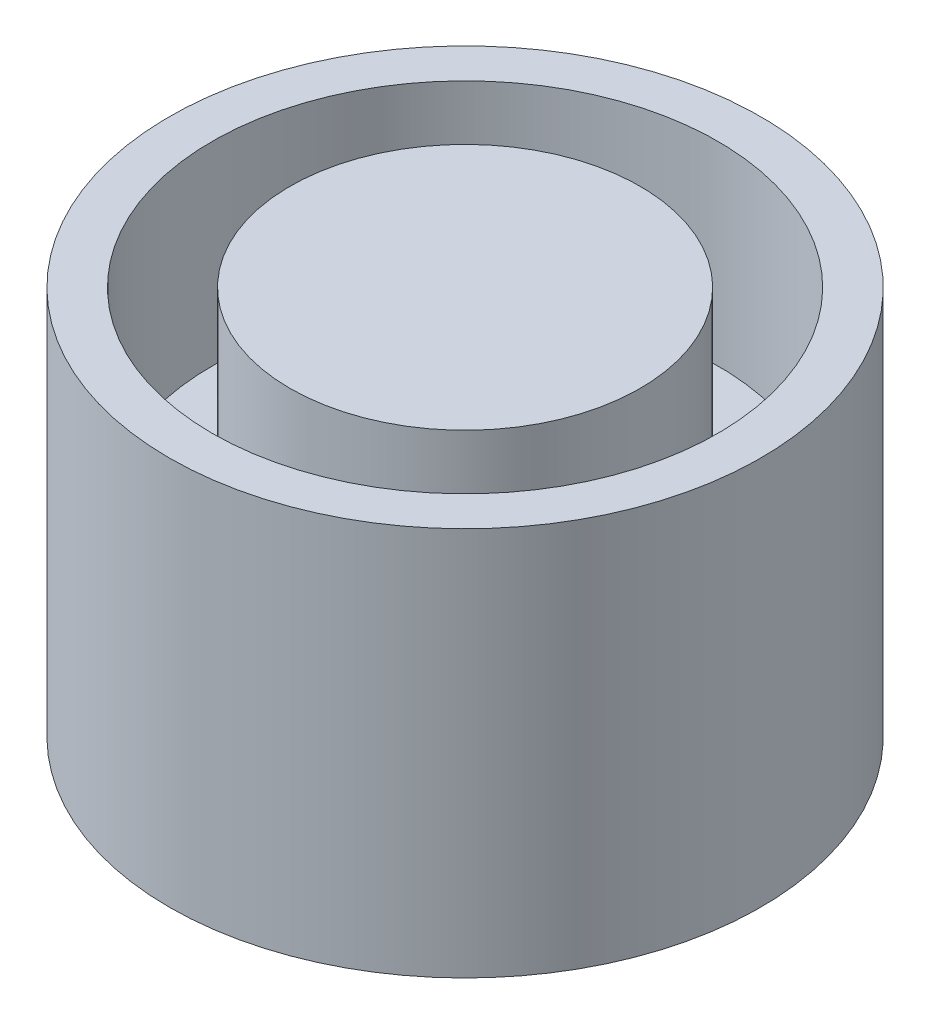
ISO-10303-21;
HEADER;
FILE_DESCRIPTION(('STEP AP214'),'2;1');
FILE_NAME('part.step','',(''),(''),'','','');
FILE_SCHEMA(('AUTOMOTIVE_DESIGN { 1 0 10303 214 1 1 1 1 }'));
ENDSEC;
DATA;
#1=APPLICATION_CONTEXT('core data for automotive mechanical design processes');
#2=APPLICATION_PROTOCOL_DEFINITION('international standard','automotive_design',2000,#1);
#3=PRODUCT_CONTEXT('',#1,'mechanical');
#4=PRODUCT('Part','Part','',(#3));
#5=PRODUCT_RELATED_PRODUCT_CATEGORY('part','',(#4));
#6=PRODUCT_DEFINITION_FORMATION('','',#4);
#7=PRODUCT_DEFINITION_CONTEXT('part definition',#1,'design');
#8=PRODUCT_DEFINITION('design','',#6,#7);
#9=PRODUCT_DEFINITION_SHAPE('','',#8);
#10=(LENGTH_UNIT() NAMED_UNIT(*) SI_UNIT(.MILLI.,.METRE.));
#11=(NAMED_UNIT(*) PLANE_ANGLE_UNIT() SI_UNIT($,.RADIAN.));
#12=(NAMED_UNIT(*) SI_UNIT($,.STERADIAN.) SOLID_ANGLE_UNIT());
#13=UNCERTAINTY_MEASURE_WITH_UNIT(LENGTH_MEASURE(1.E-05),#10,'distance_accuracy_value','');
#14=(GEOMETRIC_REPRESENTATION_CONTEXT(3) GLOBAL_UNCERTAINTY_ASSIGNED_CONTEXT((#13)) GLOBAL_UNIT_ASSIGNED_CONTEXT((#10,
#11,#12)) REPRESENTATION_CONTEXT('',''));
#15=CARTESIAN_POINT('',(0.,0.,0.));
#16=DIRECTION('',(0.,0.,1.));
#17=DIRECTION('',(1.,0.,0.));
#18=AXIS2_PLACEMENT_3D('',#15,#16,#17);
#19=CARTESIAN_POINT('',(0.,10.,0.));
#20=DIRECTION('',(0.,-1.,0.));
#21=DIRECTION('',(0.,0.,-1.));
#22=AXIS2_PLACEMENT_3D('',#19,#20,#21);
#23=CYLINDRICAL_SURFACE('',#22,7.6);
#24=CARTESIAN_POINT('',(0.,10.,0.));
#25=DIRECTION('',(0.,1.,0.));
#26=DIRECTION('',(0.,0.,1.));
#27=AXIS2_PLACEMENT_3D('',#24,#25,#26);
#28=CIRCLE('',#27,7.6);
#29=CARTESIAN_POINT('',(0.,10.,7.6));
#30=VERTEX_POINT('',#29);
#31=EDGE_CURVE('E10',#30,#30,#28,.T.);
#32=ORIENTED_EDGE('',*,*,#31,.F.);
#33=EDGE_LOOP('',(#32));
#34=FACE_BOUND('',#33,.T.);
#35=CARTESIAN_POINT('',(0.,0.,0.));
#36=DIRECTION('',(0.,1.,0.));
#37=DIRECTION('',(0.,0.,1.));
#38=AXIS2_PLACEMENT_3D('',#35,#36,#37);
#39=CIRCLE('',#38,7.6);
#40=CARTESIAN_POINT('',(0.,0.,7.6));
#41=VERTEX_POINT('',#40);
#42=EDGE_CURVE('E37',#41,#41,#39,.T.);
#43=ORIENTED_EDGE('',*,*,#42,.T.);
#44=EDGE_LOOP('',(#43));
#45=FACE_BOUND('',#44,.T.);
#46=ADVANCED_FACE('F34',(#34,#45),#23,.T.);
#47=CARTESIAN_POINT('',(0.,10.,0.));
#48=DIRECTION('',(0.,1.,0.));
#49=DIRECTION('',(0.,0.,1.));
#50=AXIS2_PLACEMENT_3D('',#47,#48,#49);
#51=PLANE('',#50);
#52=CARTESIAN_POINT('',(0.,10.,0.));
#53=DIRECTION('',(0.,1.,0.));
#54=DIRECTION('',(0.,0.,1.));
#55=AXIS2_PLACEMENT_3D('',#52,#53,#54);
#56=CIRCLE('',#55,6.5);
#57=CARTESIAN_POINT('',(0.,10.,6.5));
#58=VERTEX_POINT('',#57);
#59=EDGE_CURVE('E46',#58,#58,#56,.T.);
#60=ORIENTED_EDGE('',*,*,#59,.F.);
#61=EDGE_LOOP('',(#60));
#62=FACE_BOUND('',#61,.T.);
#63=ORIENTED_EDGE('',*,*,#31,.T.);
#64=EDGE_LOOP('',(#63));
#65=FACE_BOUND('',#64,.T.);
#66=ADVANCED_FACE('F74',(#62,#65),#51,.T.);
#67=CARTESIAN_POINT('',(0.,0.,0.));
#68=DIRECTION('',(0.,1.,0.));
#69=DIRECTION('',(0.,0.,1.));
#70=AXIS2_PLACEMENT_3D('',#67,#68,#69);
#71=PLANE('',#70);
#72=ORIENTED_EDGE('',*,*,#42,.F.);
#73=EDGE_LOOP('',(#72));
#74=FACE_BOUND('',#73,.T.);
#75=ADVANCED_FACE('F70',(#74),#71,.F.);
#76=CARTESIAN_POINT('',(0.,5.,0.));
#77=DIRECTION('',(0.,1.,0.));
#78=DIRECTION('',(0.,0.,1.));
#79=AXIS2_PLACEMENT_3D('',#76,#77,#78);
#80=CYLINDRICAL_SURFACE('',#79,6.5);
#81=CARTESIAN_POINT('',(0.,5.,0.));
#82=DIRECTION('',(0.,1.,0.));
#83=DIRECTION('',(0.,0.,1.));
#84=AXIS2_PLACEMENT_3D('',#81,#82,#83);
#85=CIRCLE('',#84,6.5);
#86=CARTESIAN_POINT('',(0.,5.,6.5));
#87=VERTEX_POINT('',#86);
#88=EDGE_CURVE('E44',#87,#87,#85,.T.);
#89=ORIENTED_EDGE('',*,*,#88,.F.);
#90=EDGE_LOOP('',(#89));
#91=FACE_BOUND('',#90,.T.);
#92=ORIENTED_EDGE('',*,*,#59,.T.);
#93=EDGE_LOOP('',(#92));
#94=FACE_BOUND('',#93,.T.);
#95=ADVANCED_FACE('F64',(#91,#94),#80,.F.);
#96=CARTESIAN_POINT('',(0.,5.,0.));
#97=DIRECTION('',(0.,1.,0.));
#98=DIRECTION('',(0.,0.,1.));
#99=AXIS2_PLACEMENT_3D('',#96,#97,#98);
#100=PLANE('',#99);
#101=CARTESIAN_POINT('',(0.,5.,0.));
#102=DIRECTION('',(0.,1.,0.));
#103=DIRECTION('',(0.,0.,1.));
#104=AXIS2_PLACEMENT_3D('',#101,#102,#103);
#105=CIRCLE('',#104,4.5);
#106=CARTESIAN_POINT('',(0.,5.,4.5));
#107=VERTEX_POINT('',#106);
#108=EDGE_CURVE('E49',#107,#107,#105,.T.);
#109=ORIENTED_EDGE('',*,*,#108,.F.);
#110=EDGE_LOOP('',(#109));
#111=FACE_BOUND('',#110,.T.);
#112=ORIENTED_EDGE('',*,*,#88,.T.);
#113=EDGE_LOOP('',(#112));
#114=FACE_BOUND('',#113,.T.);
#115=ADVANCED_FACE('F61',(#111,#114),#100,.T.);
#116=CARTESIAN_POINT('',(0.,5.,0.));
#117=DIRECTION('',(0.,1.,0.));
#118=DIRECTION('',(0.,0.,1.));
#119=AXIS2_PLACEMENT_3D('',#116,#117,#118);
#120=CYLINDRICAL_SURFACE('',#119,4.5);
#121=ORIENTED_EDGE('',*,*,#108,.T.);
#122=EDGE_LOOP('',(#121));
#123=FACE_BOUND('',#122,.T.);
#124=CARTESIAN_POINT('',(0.,10.,0.));
#125=DIRECTION('',(0.,1.,0.));
#126=DIRECTION('',(0.,0.,1.));
#127=AXIS2_PLACEMENT_3D('',#124,#125,#126);
#128=CIRCLE('',#127,4.5);
#129=CARTESIAN_POINT('',(0.,10.,4.5));
#130=VERTEX_POINT('',#129);
#131=EDGE_CURVE('E52',#130,#130,#128,.T.);
#132=ORIENTED_EDGE('',*,*,#131,.F.);
#133=EDGE_LOOP('',(#132));
#134=FACE_BOUND('',#133,.T.);
#135=ADVANCED_FACE('F58',(#123,#134),#120,.T.);
#136=ORIENTED_EDGE('',*,*,#131,.T.);
#137=EDGE_LOOP('',(#136));
#138=FACE_BOUND('',#137,.T.);
#139=ADVANCED_FACE('F77',(#138),#51,.T.);
#140=CLOSED_SHELL('',(#46,#66,#75,#95,#115,#135,#139));
#141=MANIFOLD_SOLID_BREP('B2',#140);
#142=ADVANCED_BREP_SHAPE_REPRESENTATION('',(#18,#141),#14);
#143=SHAPE_DEFINITION_REPRESENTATION(#9,#142);
ENDSEC;
END-ISO-10303-21;
